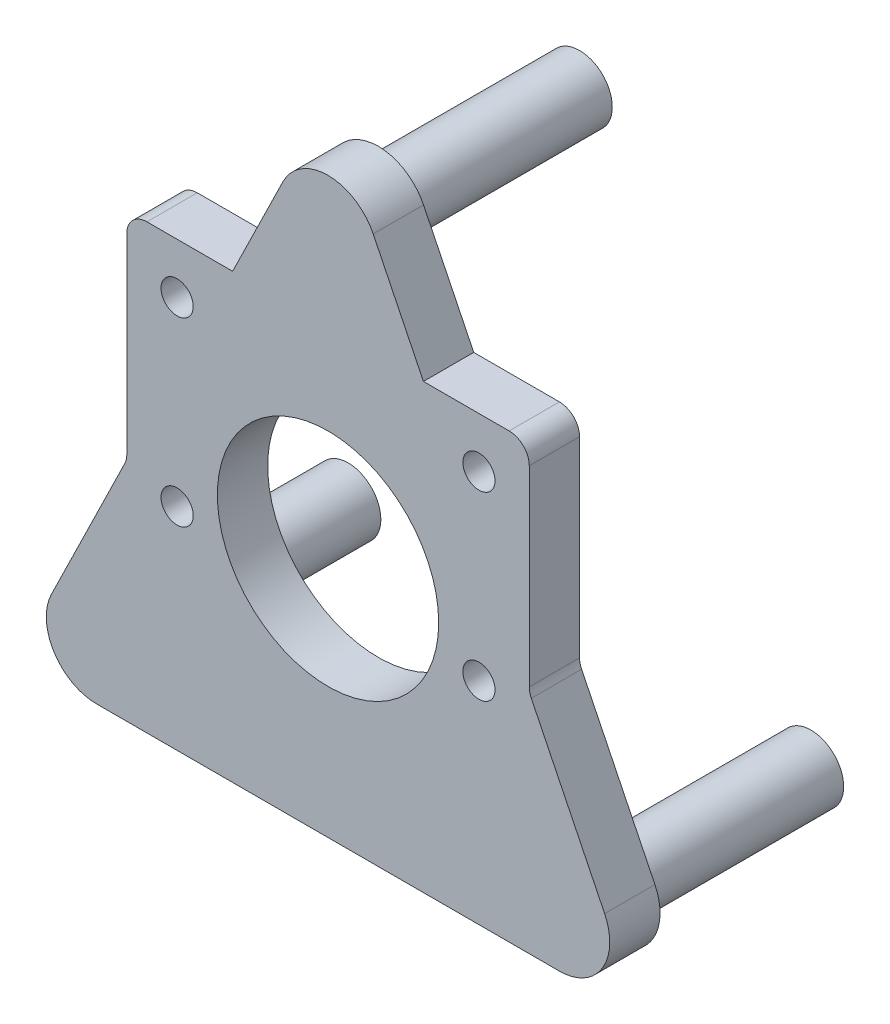
ISO-10303-21;
HEADER;
FILE_DESCRIPTION(('STEP AP214'),'2;1');
FILE_NAME('part.step','',(''),(''),'','','');
FILE_SCHEMA(('AUTOMOTIVE_DESIGN { 1 0 10303 214 1 1 1 1 }'));
ENDSEC;
DATA;
#1=APPLICATION_CONTEXT('core data for automotive mechanical design processes');
#2=APPLICATION_PROTOCOL_DEFINITION('international standard','automotive_design',2000,#1);
#3=PRODUCT_CONTEXT('',#1,'mechanical');
#4=PRODUCT('Part','Part','',(#3));
#5=PRODUCT_RELATED_PRODUCT_CATEGORY('part','',(#4));
#6=PRODUCT_DEFINITION_FORMATION('','',#4);
#7=PRODUCT_DEFINITION_CONTEXT('part definition',#1,'design');
#8=PRODUCT_DEFINITION('design','',#6,#7);
#9=PRODUCT_DEFINITION_SHAPE('','',#8);
#10=(LENGTH_UNIT() NAMED_UNIT(*) SI_UNIT(.MILLI.,.METRE.));
#11=(NAMED_UNIT(*) PLANE_ANGLE_UNIT() SI_UNIT($,.RADIAN.));
#12=(NAMED_UNIT(*) SI_UNIT($,.STERADIAN.) SOLID_ANGLE_UNIT());
#13=UNCERTAINTY_MEASURE_WITH_UNIT(LENGTH_MEASURE(1.E-05),#10,'distance_accuracy_value','');
#14=(GEOMETRIC_REPRESENTATION_CONTEXT(3) GLOBAL_UNCERTAINTY_ASSIGNED_CONTEXT((#13)) GLOBAL_UNIT_ASSIGNED_CONTEXT((#10,
#11,#12)) REPRESENTATION_CONTEXT('',''));
#15=CARTESIAN_POINT('',(0.,0.,0.));
#16=DIRECTION('',(0.,0.,1.));
#17=DIRECTION('',(1.,0.,0.));
#18=AXIS2_PLACEMENT_3D('',#15,#16,#17);
#19=CARTESIAN_POINT('',(4.49108361023889,30.1977643199041,5.));
#20=DIRECTION('',(-0.898216722047777,-0.439552863980827,0.));
#21=DIRECTION('',(0.439552863980827,-0.898216722047777,0.));
#22=AXIS2_PLACEMENT_3D('',#19,#20,#21);
#23=PLANE('',#22);
#24=DIRECTION('',(-0.439552863980827,0.898216722047776,0.));
#25=VECTOR('',#24,1.);
#26=CARTESIAN_POINT('',(4.49108361023889,30.1977643199041,5.));
#27=LINE('',#26,#25);
#28=CARTESIAN_POINT('',(9.48147891572389,20.,5.));
#29=VERTEX_POINT('',#28);
#30=CARTESIAN_POINT('',(4.49108361023889,30.1977643199041,5.));
#31=VERTEX_POINT('',#30);
#32=EDGE_CURVE('E168',#29,#31,#27,.T.);
#33=ORIENTED_EDGE('',*,*,#32,.F.);
#34=DIRECTION('',(0.,0.,1.));
#35=VECTOR('',#34,1.);
#36=CARTESIAN_POINT('',(9.4814789157239,20.,0.));
#37=LINE('',#36,#35);
#38=CARTESIAN_POINT('',(9.4814789157239,20.,0.));
#39=VERTEX_POINT('',#38);
#40=EDGE_CURVE('E156',#39,#29,#37,.T.);
#41=ORIENTED_EDGE('',*,*,#40,.F.);
#42=DIRECTION('',(-0.439552863980827,0.898216722047776,0.));
#43=VECTOR('',#42,1.);
#44=CARTESIAN_POINT('',(4.49108361023889,30.1977643199041,0.));
#45=LINE('',#44,#43);
#46=CARTESIAN_POINT('',(4.49108361023889,30.1977643199041,0.));
#47=VERTEX_POINT('',#46);
#48=EDGE_CURVE('E166',#39,#47,#45,.T.);
#49=ORIENTED_EDGE('',*,*,#48,.T.);
#50=DIRECTION('',(0.,0.,-1.));
#51=VECTOR('',#50,1.);
#52=CARTESIAN_POINT('',(4.49108361023889,30.1977643199041,5.));
#53=LINE('',#52,#51);
#54=EDGE_CURVE('E220',#31,#47,#53,.T.);
#55=ORIENTED_EDGE('',*,*,#54,.F.);
#56=EDGE_LOOP('',(#33,#41,#49,#55));
#57=FACE_BOUND('',#56,.T.);
#58=ADVANCED_FACE('F39',(#57),#23,.F.);
#59=CARTESIAN_POINT('',(-4.49108361023889,30.1977643199041,5.));
#60=DIRECTION('',(0.898216722047777,-0.439552863980827,0.));
#61=DIRECTION('',(0.439552863980827,0.898216722047777,0.));
#62=AXIS2_PLACEMENT_3D('',#59,#60,#61);
#63=PLANE('',#62);
#64=DIRECTION('',(-0.439552863980827,-0.898216722047776,0.));
#65=VECTOR('',#64,1.);
#66=CARTESIAN_POINT('',(-4.49108361023889,30.1977643199041,5.));
#67=LINE('',#66,#65);
#68=CARTESIAN_POINT('',(-20.2035665559044,-1.91035300384722,5.));
#69=VERTEX_POINT('',#68);
#70=CARTESIAN_POINT('',(-27.4910836102389,-16.8022356800959,5.));
#71=VERTEX_POINT('',#70);
#72=EDGE_CURVE('E301',#69,#71,#67,.T.);
#73=ORIENTED_EDGE('',*,*,#72,.F.);
#74=DIRECTION('',(0.,0.,1.));
#75=VECTOR('',#74,1.);
#76=CARTESIAN_POINT('',(-20.2035665559045,-1.91035300384722,5.));
#77=LINE('',#76,#75);
#78=CARTESIAN_POINT('',(-20.2035665559044,-1.91035300384722,0.));
#79=VERTEX_POINT('',#78);
#80=EDGE_CURVE('E269',#69,#79,#77,.F.);
#81=ORIENTED_EDGE('',*,*,#80,.T.);
#82=DIRECTION('',(-0.439552863980827,-0.898216722047776,0.));
#83=VECTOR('',#82,1.);
#84=CARTESIAN_POINT('',(-4.49108361023889,30.1977643199041,0.));
#85=LINE('',#84,#83);
#86=CARTESIAN_POINT('',(-27.4910836102389,-16.8022356800959,0.));
#87=VERTEX_POINT('',#86);
#88=EDGE_CURVE('E191',#79,#87,#85,.T.);
#89=ORIENTED_EDGE('',*,*,#88,.T.);
#90=DIRECTION('',(0.,0.,-1.));
#91=VECTOR('',#90,1.);
#92=CARTESIAN_POINT('',(-27.4910836102389,-16.8022356800959,5.));
#93=LINE('',#92,#91);
#94=EDGE_CURVE('E212',#71,#87,#93,.T.);
#95=ORIENTED_EDGE('',*,*,#94,.F.);
#96=EDGE_LOOP('',(#73,#81,#89,#95));
#97=FACE_BOUND('',#96,.T.);
#98=ADVANCED_FACE('F308',(#97),#63,.F.);
#99=CARTESIAN_POINT('',(23.,-19.,5.));
#100=DIRECTION('',(0.,0.,1.));
#101=DIRECTION('',(1.,0.,0.));
#102=AXIS2_PLACEMENT_3D('',#99,#100,#101);
#103=PLANE('',#102);
#104=CARTESIAN_POINT('',(-14.9999999999998,-3.,5.));
#105=DIRECTION('',(0.,0.,1.));
#106=DIRECTION('',(1.,0.,0.));
#107=AXIS2_PLACEMENT_3D('',#104,#105,#106);
#108=CIRCLE('',#107,1.6);
#109=CARTESIAN_POINT('',(-13.3999999999998,-3.,5.));
#110=VERTEX_POINT('',#109);
#111=EDGE_CURVE('E415',#110,#110,#108,.T.);
#112=ORIENTED_EDGE('',*,*,#111,.F.);
#113=EDGE_LOOP('',(#112));
#114=FACE_BOUND('',#113,.T.);
#115=CARTESIAN_POINT('',(15.0000000000002,-3.,5.));
#116=DIRECTION('',(0.,0.,1.));
#117=DIRECTION('',(1.,0.,0.));
#118=AXIS2_PLACEMENT_3D('',#115,#116,#117);
#119=CIRCLE('',#118,1.6);
#120=CARTESIAN_POINT('',(16.6000000000002,-3.,5.));
#121=VERTEX_POINT('',#120);
#122=EDGE_CURVE('E423',#121,#121,#119,.T.);
#123=ORIENTED_EDGE('',*,*,#122,.F.);
#124=EDGE_LOOP('',(#123));
#125=FACE_BOUND('',#124,.T.);
#126=CARTESIAN_POINT('',(15.,15.,5.));
#127=DIRECTION('',(0.,0.,1.));
#128=DIRECTION('',(1.,0.,0.));
#129=AXIS2_PLACEMENT_3D('',#126,#127,#128);
#130=CIRCLE('',#129,1.6);
#131=CARTESIAN_POINT('',(16.6,15.,5.));
#132=VERTEX_POINT('',#131);
#133=EDGE_CURVE('E431',#132,#132,#130,.T.);
#134=ORIENTED_EDGE('',*,*,#133,.F.);
#135=EDGE_LOOP('',(#134));
#136=FACE_BOUND('',#135,.T.);
#137=CARTESIAN_POINT('',(-15.,15.,5.));
#138=DIRECTION('',(0.,0.,1.));
#139=DIRECTION('',(1.,0.,0.));
#140=AXIS2_PLACEMENT_3D('',#137,#138,#139);
#141=CIRCLE('',#140,1.6);
#142=CARTESIAN_POINT('',(-13.4,15.,5.));
#143=VERTEX_POINT('',#142);
#144=EDGE_CURVE('E407',#143,#143,#141,.T.);
#145=ORIENTED_EDGE('',*,*,#144,.F.);
#146=EDGE_LOOP('',(#145));
#147=FACE_BOUND('',#146,.T.);
#148=DIRECTION('',(0.,1.,0.));
#149=VECTOR('',#148,1.);
#150=CARTESIAN_POINT('',(20.,20.,5.));
#151=LINE('',#150,#149);
#152=CARTESIAN_POINT('',(20.,-1.03124727588557,5.));
#153=VERTEX_POINT('',#152);
#154=CARTESIAN_POINT('',(20.,18.,5.));
#155=VERTEX_POINT('',#154);
#156=EDGE_CURVE('E162',#153,#155,#151,.T.);
#157=ORIENTED_EDGE('',*,*,#156,.T.);
#158=CARTESIAN_POINT('',(18.,18.,5.));
#159=DIRECTION('',(0.,0.,1.));
#160=DIRECTION('',(1.,0.,0.));
#161=AXIS2_PLACEMENT_3D('',#158,#159,#160);
#162=CIRCLE('',#161,2.);
#163=CARTESIAN_POINT('',(18.,20.,5.));
#164=VERTEX_POINT('',#163);
#165=EDGE_CURVE('E275',#155,#164,#162,.T.);
#166=ORIENTED_EDGE('',*,*,#165,.T.);
#167=DIRECTION('',(-1.,0.,0.));
#168=VECTOR('',#167,1.);
#169=CARTESIAN_POINT('',(9.4814789157239,20.,5.));
#170=LINE('',#169,#168);
#171=EDGE_CURVE('E396',#164,#29,#170,.T.);
#172=ORIENTED_EDGE('',*,*,#171,.T.);
#173=ORIENTED_EDGE('',*,*,#32,.T.);
#174=CARTESIAN_POINT('',(0.,28.,5.));
#175=DIRECTION('',(0.,0.,1.));
#176=DIRECTION('',(1.,0.,0.));
#177=AXIS2_PLACEMENT_3D('',#174,#175,#176);
#178=CIRCLE('',#177,5.00000000000001);
#179=CARTESIAN_POINT('',(-4.49108361023889,30.1977643199041,5.));
#180=VERTEX_POINT('',#179);
#181=EDGE_CURVE('E313',#31,#180,#178,.T.);
#182=ORIENTED_EDGE('',*,*,#181,.T.);
#183=CARTESIAN_POINT('',(-9.48147891572389,20.,5.));
#184=VERTEX_POINT('',#183);
#185=EDGE_CURVE('E312',#180,#184,#67,.T.);
#186=ORIENTED_EDGE('',*,*,#185,.T.);
#187=DIRECTION('',(-1.,0.,0.));
#188=VECTOR('',#187,1.);
#189=CARTESIAN_POINT('',(-20.,20.,5.));
#190=LINE('',#189,#188);
#191=CARTESIAN_POINT('',(-18.,20.,5.));
#192=VERTEX_POINT('',#191);
#193=EDGE_CURVE('E325',#184,#192,#190,.T.);
#194=ORIENTED_EDGE('',*,*,#193,.T.);
#195=CARTESIAN_POINT('',(-18.,18.,5.));
#196=DIRECTION('',(0.,0.,1.));
#197=DIRECTION('',(1.,0.,0.));
#198=AXIS2_PLACEMENT_3D('',#195,#196,#197);
#199=CIRCLE('',#198,2.);
#200=CARTESIAN_POINT('',(-20.,18.,5.));
#201=VERTEX_POINT('',#200);
#202=EDGE_CURVE('E272',#192,#201,#199,.T.);
#203=ORIENTED_EDGE('',*,*,#202,.T.);
#204=DIRECTION('',(0.,-1.,0.));
#205=VECTOR('',#204,1.);
#206=CARTESIAN_POINT('',(-20.,20.,5.));
#207=LINE('',#206,#205);
#208=CARTESIAN_POINT('',(-20.,-1.03124727588557,5.));
#209=VERTEX_POINT('',#208);
#210=EDGE_CURVE('E170',#201,#209,#207,.T.);
#211=ORIENTED_EDGE('',*,*,#210,.T.);
#212=CARTESIAN_POINT('',(-22.,-1.03124727588557,5.));
#213=DIRECTION('',(0.,0.,1.));
#214=DIRECTION('',(1.,0.,0.));
#215=AXIS2_PLACEMENT_3D('',#212,#213,#214);
#216=CIRCLE('',#215,2.);
#217=EDGE_CURVE('E48',#209,#69,#216,.F.);
#218=ORIENTED_EDGE('',*,*,#217,.T.);
#219=ORIENTED_EDGE('',*,*,#72,.T.);
#220=CARTESIAN_POINT('',(-23.,-19.,5.));
#221=DIRECTION('',(0.,0.,1.));
#222=DIRECTION('',(1.,0.,0.));
#223=AXIS2_PLACEMENT_3D('',#220,#221,#222);
#224=CIRCLE('',#223,5.);
#225=CARTESIAN_POINT('',(-23.,-24.,5.));
#226=VERTEX_POINT('',#225);
#227=EDGE_CURVE('E370',#71,#226,#224,.T.);
#228=ORIENTED_EDGE('',*,*,#227,.T.);
#229=DIRECTION('',(1.,0.,0.));
#230=VECTOR('',#229,1.);
#231=CARTESIAN_POINT('',(-23.,-24.,5.));
#232=LINE('',#231,#230);
#233=CARTESIAN_POINT('',(23.,-24.,5.));
#234=VERTEX_POINT('',#233);
#235=EDGE_CURVE('E208',#226,#234,#232,.T.);
#236=ORIENTED_EDGE('',*,*,#235,.T.);
#237=CARTESIAN_POINT('',(23.,-19.,5.));
#238=DIRECTION('',(0.,0.,1.));
#239=DIRECTION('',(1.,0.,0.));
#240=AXIS2_PLACEMENT_3D('',#237,#238,#239);
#241=CIRCLE('',#240,5.00000000000001);
#242=CARTESIAN_POINT('',(27.4910836102389,-16.8022356800959,5.));
#243=VERTEX_POINT('',#242);
#244=EDGE_CURVE('E202',#234,#243,#241,.T.);
#245=ORIENTED_EDGE('',*,*,#244,.T.);
#246=CARTESIAN_POINT('',(20.2035665559044,-1.91035300384722,5.));
#247=VERTEX_POINT('',#246);
#248=EDGE_CURVE('E362',#243,#247,#27,.T.);
#249=ORIENTED_EDGE('',*,*,#248,.T.);
#250=CARTESIAN_POINT('',(22.,-1.03124727588557,5.));
#251=DIRECTION('',(0.,0.,1.));
#252=DIRECTION('',(1.,0.,0.));
#253=AXIS2_PLACEMENT_3D('',#250,#251,#252);
#254=CIRCLE('',#253,2.);
#255=EDGE_CURVE('E289',#247,#153,#254,.F.);
#256=ORIENTED_EDGE('',*,*,#255,.T.);
#257=EDGE_LOOP('',(#157,#166,#172,#173,#182,#186,#194,#203,#211,#218,#219,#228,#236,#245,#249,#256));
#258=FACE_BOUND('',#257,.T.);
#259=CARTESIAN_POINT('',(0.,0.,5.));
#260=DIRECTION('',(0.,0.,1.));
#261=DIRECTION('',(1.,0.,0.));
#262=AXIS2_PLACEMENT_3D('',#259,#260,#261);
#263=CIRCLE('',#262,11.);
#264=CARTESIAN_POINT('',(11.,0.,5.));
#265=VERTEX_POINT('',#264);
#266=EDGE_CURVE('E185',#265,#265,#263,.T.);
#267=ORIENTED_EDGE('',*,*,#266,.F.);
#268=EDGE_LOOP('',(#267));
#269=FACE_BOUND('',#268,.T.);
#270=ADVANCED_FACE('F299',(#114,#125,#136,#147,#258,#269),#103,.T.);
#271=CARTESIAN_POINT('',(23.,-19.,0.));
#272=DIRECTION('',(0.,0.,1.));
#273=DIRECTION('',(1.,0.,0.));
#274=AXIS2_PLACEMENT_3D('',#271,#272,#273);
#275=PLANE('',#274);
#276=CARTESIAN_POINT('',(-14.9999999999998,-3.,0.));
#277=DIRECTION('',(0.,0.,1.));
#278=DIRECTION('',(1.,0.,0.));
#279=AXIS2_PLACEMENT_3D('',#276,#277,#278);
#280=CIRCLE('',#279,1.6);
#281=CARTESIAN_POINT('',(-13.3999999999998,-3.,0.));
#282=VERTEX_POINT('',#281);
#283=EDGE_CURVE('E419',#282,#282,#280,.T.);
#284=ORIENTED_EDGE('',*,*,#283,.T.);
#285=EDGE_LOOP('',(#284));
#286=FACE_BOUND('',#285,.T.);
#287=CARTESIAN_POINT('',(15.0000000000002,-3.,0.));
#288=DIRECTION('',(0.,0.,1.));
#289=DIRECTION('',(1.,0.,0.));
#290=AXIS2_PLACEMENT_3D('',#287,#288,#289);
#291=CIRCLE('',#290,1.6);
#292=CARTESIAN_POINT('',(16.6000000000002,-3.,0.));
#293=VERTEX_POINT('',#292);
#294=EDGE_CURVE('E427',#293,#293,#291,.T.);
#295=ORIENTED_EDGE('',*,*,#294,.T.);
#296=EDGE_LOOP('',(#295));
#297=FACE_BOUND('',#296,.T.);
#298=CARTESIAN_POINT('',(15.,15.,0.));
#299=DIRECTION('',(0.,0.,1.));
#300=DIRECTION('',(1.,0.,0.));
#301=AXIS2_PLACEMENT_3D('',#298,#299,#300);
#302=CIRCLE('',#301,1.6);
#303=CARTESIAN_POINT('',(16.6,15.,0.));
#304=VERTEX_POINT('',#303);
#305=EDGE_CURVE('E413',#304,#304,#302,.T.);
#306=ORIENTED_EDGE('',*,*,#305,.T.);
#307=EDGE_LOOP('',(#306));
#308=FACE_BOUND('',#307,.T.);
#309=CARTESIAN_POINT('',(-15.,15.,0.));
#310=DIRECTION('',(0.,0.,1.));
#311=DIRECTION('',(1.,0.,0.));
#312=AXIS2_PLACEMENT_3D('',#309,#310,#311);
#313=CIRCLE('',#312,1.6);
#314=CARTESIAN_POINT('',(-13.4,15.,0.));
#315=VERTEX_POINT('',#314);
#316=EDGE_CURVE('E404',#315,#315,#313,.T.);
#317=ORIENTED_EDGE('',*,*,#316,.T.);
#318=EDGE_LOOP('',(#317));
#319=FACE_BOUND('',#318,.T.);
#320=CARTESIAN_POINT('',(-23.,-19.,0.));
#321=DIRECTION('',(0.,0.,1.));
#322=DIRECTION('',(1.,0.,0.));
#323=AXIS2_PLACEMENT_3D('',#320,#321,#322);
#324=CIRCLE('',#323,4.25);
#325=CARTESIAN_POINT('',(-18.75,-19.,0.));
#326=VERTEX_POINT('',#325);
#327=EDGE_CURVE('E239',#326,#326,#324,.T.);
#328=ORIENTED_EDGE('',*,*,#327,.T.);
#329=EDGE_LOOP('',(#328));
#330=FACE_BOUND('',#329,.T.);
#331=CARTESIAN_POINT('',(23.,-19.,0.));
#332=DIRECTION('',(0.,0.,1.));
#333=DIRECTION('',(1.,0.,0.));
#334=AXIS2_PLACEMENT_3D('',#331,#332,#333);
#335=CIRCLE('',#334,4.25);
#336=CARTESIAN_POINT('',(27.25,-19.,0.));
#337=VERTEX_POINT('',#336);
#338=EDGE_CURVE('E235',#337,#337,#335,.T.);
#339=ORIENTED_EDGE('',*,*,#338,.T.);
#340=EDGE_LOOP('',(#339));
#341=FACE_BOUND('',#340,.T.);
#342=CARTESIAN_POINT('',(0.,28.,0.));
#343=DIRECTION('',(0.,0.,1.));
#344=DIRECTION('',(1.,0.,0.));
#345=AXIS2_PLACEMENT_3D('',#342,#343,#344);
#346=CIRCLE('',#345,4.25);
#347=CARTESIAN_POINT('',(4.25,28.,0.));
#348=VERTEX_POINT('',#347);
#349=EDGE_CURVE('E231',#348,#348,#346,.T.);
#350=ORIENTED_EDGE('',*,*,#349,.T.);
#351=EDGE_LOOP('',(#350));
#352=FACE_BOUND('',#351,.T.);
#353=DIRECTION('',(-1.,0.,0.));
#354=VECTOR('',#353,1.);
#355=CARTESIAN_POINT('',(9.4814789157239,20.,0.));
#356=LINE('',#355,#354);
#357=CARTESIAN_POINT('',(18.,20.,0.));
#358=VERTEX_POINT('',#357);
#359=EDGE_CURVE('E153',#358,#39,#356,.T.);
#360=ORIENTED_EDGE('',*,*,#359,.F.);
#361=CARTESIAN_POINT('',(18.,18.,0.));
#362=DIRECTION('',(0.,0.,1.));
#363=DIRECTION('',(1.,0.,0.));
#364=AXIS2_PLACEMENT_3D('',#361,#362,#363);
#365=CIRCLE('',#364,2.);
#366=CARTESIAN_POINT('',(20.,18.,0.));
#367=VERTEX_POINT('',#366);
#368=EDGE_CURVE('E282',#358,#367,#365,.F.);
#369=ORIENTED_EDGE('',*,*,#368,.T.);
#370=DIRECTION('',(0.,1.,0.));
#371=VECTOR('',#370,1.);
#372=CARTESIAN_POINT('',(20.,20.,0.));
#373=LINE('',#372,#371);
#374=CARTESIAN_POINT('',(20.,-1.03124727588557,0.));
#375=VERTEX_POINT('',#374);
#376=EDGE_CURVE('E161',#375,#367,#373,.T.);
#377=ORIENTED_EDGE('',*,*,#376,.F.);
#378=CARTESIAN_POINT('',(22.,-1.03124727588557,0.));
#379=DIRECTION('',(0.,0.,1.));
#380=DIRECTION('',(1.,0.,0.));
#381=AXIS2_PLACEMENT_3D('',#378,#379,#380);
#382=CIRCLE('',#381,2.);
#383=CARTESIAN_POINT('',(20.2035665559044,-1.91035300384722,0.));
#384=VERTEX_POINT('',#383);
#385=EDGE_CURVE('E292',#375,#384,#382,.T.);
#386=ORIENTED_EDGE('',*,*,#385,.T.);
#387=CARTESIAN_POINT('',(27.4910836102389,-16.8022356800959,0.));
#388=VERTEX_POINT('',#387);
#389=EDGE_CURVE('E178',#388,#384,#45,.T.);
#390=ORIENTED_EDGE('',*,*,#389,.F.);
#391=CARTESIAN_POINT('',(23.,-19.,0.));
#392=DIRECTION('',(0.,0.,1.));
#393=DIRECTION('',(1.,0.,0.));
#394=AXIS2_PLACEMENT_3D('',#391,#392,#393);
#395=CIRCLE('',#394,5.00000000000001);
#396=CARTESIAN_POINT('',(23.,-24.,0.));
#397=VERTEX_POINT('',#396);
#398=EDGE_CURVE('E179',#397,#388,#395,.T.);
#399=ORIENTED_EDGE('',*,*,#398,.F.);
#400=DIRECTION('',(1.,0.,0.));
#401=VECTOR('',#400,1.);
#402=CARTESIAN_POINT('',(-23.,-24.,0.));
#403=LINE('',#402,#401);
#404=CARTESIAN_POINT('',(-23.,-24.,0.));
#405=VERTEX_POINT('',#404);
#406=EDGE_CURVE('E199',#405,#397,#403,.T.);
#407=ORIENTED_EDGE('',*,*,#406,.F.);
#408=CARTESIAN_POINT('',(-23.,-19.,0.));
#409=DIRECTION('',(0.,0.,1.));
#410=DIRECTION('',(1.,0.,0.));
#411=AXIS2_PLACEMENT_3D('',#408,#409,#410);
#412=CIRCLE('',#411,5.);
#413=EDGE_CURVE('E196',#87,#405,#412,.T.);
#414=ORIENTED_EDGE('',*,*,#413,.F.);
#415=ORIENTED_EDGE('',*,*,#88,.F.);
#416=CARTESIAN_POINT('',(-22.,-1.03124727588557,0.));
#417=DIRECTION('',(0.,0.,1.));
#418=DIRECTION('',(1.,0.,0.));
#419=AXIS2_PLACEMENT_3D('',#416,#417,#418);
#420=CIRCLE('',#419,2.);
#421=CARTESIAN_POINT('',(-20.,-1.03124727588557,0.));
#422=VERTEX_POINT('',#421);
#423=EDGE_CURVE('E11',#79,#422,#420,.T.);
#424=ORIENTED_EDGE('',*,*,#423,.T.);
#425=DIRECTION('',(0.,-1.,0.));
#426=VECTOR('',#425,1.);
#427=CARTESIAN_POINT('',(-20.,20.,0.));
#428=LINE('',#427,#426);
#429=CARTESIAN_POINT('',(-20.,18.,0.));
#430=VERTEX_POINT('',#429);
#431=EDGE_CURVE('E318',#430,#422,#428,.T.);
#432=ORIENTED_EDGE('',*,*,#431,.F.);
#433=CARTESIAN_POINT('',(-18.,18.,0.));
#434=DIRECTION('',(0.,0.,1.));
#435=DIRECTION('',(1.,0.,0.));
#436=AXIS2_PLACEMENT_3D('',#433,#434,#435);
#437=CIRCLE('',#436,2.);
#438=CARTESIAN_POINT('',(-18.,20.,0.));
#439=VERTEX_POINT('',#438);
#440=EDGE_CURVE('E55',#430,#439,#437,.F.);
#441=ORIENTED_EDGE('',*,*,#440,.T.);
#442=DIRECTION('',(-1.,0.,0.));
#443=VECTOR('',#442,1.);
#444=CARTESIAN_POINT('',(-20.,20.,0.));
#445=LINE('',#444,#443);
#446=CARTESIAN_POINT('',(-9.48147891572389,20.,0.));
#447=VERTEX_POINT('',#446);
#448=EDGE_CURVE('E324',#447,#439,#445,.T.);
#449=ORIENTED_EDGE('',*,*,#448,.F.);
#450=CARTESIAN_POINT('',(-4.49108361023889,30.1977643199041,0.));
#451=VERTEX_POINT('',#450);
#452=EDGE_CURVE('E192',#451,#447,#85,.T.);
#453=ORIENTED_EDGE('',*,*,#452,.F.);
#454=CARTESIAN_POINT('',(0.,28.,0.));
#455=DIRECTION('',(0.,0.,1.));
#456=DIRECTION('',(1.,0.,0.));
#457=AXIS2_PLACEMENT_3D('',#454,#455,#456);
#458=CIRCLE('',#457,5.00000000000001);
#459=EDGE_CURVE('E176',#47,#451,#458,.T.);
#460=ORIENTED_EDGE('',*,*,#459,.F.);
#461=ORIENTED_EDGE('',*,*,#48,.F.);
#462=EDGE_LOOP('',(#360,#369,#377,#386,#390,#399,#407,#414,#415,#424,#432,#441,#449,#453,#460,#461));
#463=FACE_BOUND('',#462,.T.);
#464=CARTESIAN_POINT('',(0.,0.,0.));
#465=DIRECTION('',(0.,0.,1.));
#466=DIRECTION('',(1.,0.,0.));
#467=AXIS2_PLACEMENT_3D('',#464,#465,#466);
#468=CIRCLE('',#467,11.);
#469=CARTESIAN_POINT('',(11.,0.,0.));
#470=VERTEX_POINT('',#469);
#471=EDGE_CURVE('E352',#470,#470,#468,.T.);
#472=ORIENTED_EDGE('',*,*,#471,.T.);
#473=EDGE_LOOP('',(#472));
#474=FACE_BOUND('',#473,.T.);
#475=ADVANCED_FACE('F173',(#286,#297,#308,#319,#330,#341,#352,#463,#474),#275,.F.);
#476=CARTESIAN_POINT('',(23.,-19.,5.));
#477=DIRECTION('',(0.,0.,-1.));
#478=DIRECTION('',(-1.,0.,0.));
#479=AXIS2_PLACEMENT_3D('',#476,#477,#478);
#480=CYLINDRICAL_SURFACE('',#479,5.00000000000001);
#481=ORIENTED_EDGE('',*,*,#398,.T.);
#482=DIRECTION('',(0.,0.,-1.));
#483=VECTOR('',#482,1.);
#484=CARTESIAN_POINT('',(27.4910836102389,-16.8022356800959,5.));
#485=LINE('',#484,#483);
#486=EDGE_CURVE('E223',#243,#388,#485,.T.);
#487=ORIENTED_EDGE('',*,*,#486,.F.);
#488=ORIENTED_EDGE('',*,*,#244,.F.);
#489=DIRECTION('',(0.,0.,-1.));
#490=VECTOR('',#489,1.);
#491=CARTESIAN_POINT('',(23.,-24.,5.));
#492=LINE('',#491,#490);
#493=EDGE_CURVE('E203',#234,#397,#492,.T.);
#494=ORIENTED_EDGE('',*,*,#493,.T.);
#495=EDGE_LOOP('',(#481,#487,#488,#494));
#496=FACE_BOUND('',#495,.T.);
#497=ADVANCED_FACE('F383',(#496),#480,.T.);
#498=ORIENTED_EDGE('',*,*,#389,.T.);
#499=DIRECTION('',(0.,0.,1.));
#500=VECTOR('',#499,1.);
#501=CARTESIAN_POINT('',(20.2035665559044,-1.91035300384722,5.));
#502=LINE('',#501,#500);
#503=EDGE_CURVE('E251',#384,#247,#502,.T.);
#504=ORIENTED_EDGE('',*,*,#503,.T.);
#505=ORIENTED_EDGE('',*,*,#248,.F.);
#506=ORIENTED_EDGE('',*,*,#486,.T.);
#507=EDGE_LOOP('',(#498,#504,#505,#506));
#508=FACE_BOUND('',#507,.T.);
#509=ADVANCED_FACE('F385',(#508),#23,.F.);
#510=CARTESIAN_POINT('',(0.,28.,5.));
#511=DIRECTION('',(0.,0.,-1.));
#512=DIRECTION('',(-1.,0.,0.));
#513=AXIS2_PLACEMENT_3D('',#510,#511,#512);
#514=CYLINDRICAL_SURFACE('',#513,5.00000000000001);
#515=ORIENTED_EDGE('',*,*,#459,.T.);
#516=DIRECTION('',(0.,0.,-1.));
#517=VECTOR('',#516,1.);
#518=CARTESIAN_POINT('',(-4.49108361023889,30.1977643199041,5.));
#519=LINE('',#518,#517);
#520=EDGE_CURVE('E216',#180,#451,#519,.T.);
#521=ORIENTED_EDGE('',*,*,#520,.F.);
#522=ORIENTED_EDGE('',*,*,#181,.F.);
#523=ORIENTED_EDGE('',*,*,#54,.T.);
#524=EDGE_LOOP('',(#515,#521,#522,#523));
#525=FACE_BOUND('',#524,.T.);
#526=ADVANCED_FACE('F474',(#525),#514,.T.);
#527=ORIENTED_EDGE('',*,*,#452,.T.);
#528=DIRECTION('',(0.,0.,1.));
#529=VECTOR('',#528,1.);
#530=CARTESIAN_POINT('',(-9.48147891572389,20.,0.));
#531=LINE('',#530,#529);
#532=EDGE_CURVE('E329',#447,#184,#531,.T.);
#533=ORIENTED_EDGE('',*,*,#532,.T.);
#534=ORIENTED_EDGE('',*,*,#185,.F.);
#535=ORIENTED_EDGE('',*,*,#520,.T.);
#536=EDGE_LOOP('',(#527,#533,#534,#535));
#537=FACE_BOUND('',#536,.T.);
#538=ADVANCED_FACE('F470',(#537),#63,.F.);
#539=CARTESIAN_POINT('',(-23.,-19.,5.));
#540=DIRECTION('',(0.,0.,-1.));
#541=DIRECTION('',(-1.,0.,0.));
#542=AXIS2_PLACEMENT_3D('',#539,#540,#541);
#543=CYLINDRICAL_SURFACE('',#542,5.);
#544=ORIENTED_EDGE('',*,*,#413,.T.);
#545=DIRECTION('',(0.,0.,-1.));
#546=VECTOR('',#545,1.);
#547=CARTESIAN_POINT('',(-23.,-24.,5.));
#548=LINE('',#547,#546);
#549=EDGE_CURVE('E207',#226,#405,#548,.T.);
#550=ORIENTED_EDGE('',*,*,#549,.F.);
#551=ORIENTED_EDGE('',*,*,#227,.F.);
#552=ORIENTED_EDGE('',*,*,#94,.T.);
#553=EDGE_LOOP('',(#544,#550,#551,#552));
#554=FACE_BOUND('',#553,.T.);
#555=ADVANCED_FACE('F685',(#554),#543,.T.);
#556=CARTESIAN_POINT('',(-23.,-24.,5.));
#557=DIRECTION('',(0.,1.,0.));
#558=DIRECTION('',(-1.,0.,0.));
#559=AXIS2_PLACEMENT_3D('',#556,#557,#558);
#560=PLANE('',#559);
#561=ORIENTED_EDGE('',*,*,#406,.T.);
#562=ORIENTED_EDGE('',*,*,#493,.F.);
#563=ORIENTED_EDGE('',*,*,#235,.F.);
#564=ORIENTED_EDGE('',*,*,#549,.T.);
#565=EDGE_LOOP('',(#561,#562,#563,#564));
#566=FACE_BOUND('',#565,.T.);
#567=ADVANCED_FACE('F379',(#566),#560,.F.);
#568=CARTESIAN_POINT('',(0.,0.,5.));
#569=DIRECTION('',(0.,0.,-1.));
#570=DIRECTION('',(-1.,0.,0.));
#571=AXIS2_PLACEMENT_3D('',#568,#569,#570);
#572=CYLINDRICAL_SURFACE('',#571,11.);
#573=ORIENTED_EDGE('',*,*,#266,.T.);
#574=EDGE_LOOP('',(#573));
#575=FACE_BOUND('',#574,.T.);
#576=ORIENTED_EDGE('',*,*,#471,.F.);
#577=EDGE_LOOP('',(#576));
#578=FACE_BOUND('',#577,.T.);
#579=ADVANCED_FACE('F671',(#575,#578),#572,.F.);
#580=CARTESIAN_POINT('',(0.,28.,-20.));
#581=DIRECTION('',(0.,0.,1.));
#582=DIRECTION('',(1.,0.,0.));
#583=AXIS2_PLACEMENT_3D('',#580,#581,#582);
#584=CYLINDRICAL_SURFACE('',#583,3.25);
#585=CARTESIAN_POINT('',(0.,28.,-1.));
#586=DIRECTION('',(0.,0.,1.));
#587=DIRECTION('',(1.,0.,0.));
#588=AXIS2_PLACEMENT_3D('',#585,#586,#587);
#589=CIRCLE('',#588,3.25);
#590=CARTESIAN_POINT('',(3.25,28.,-1.));
#591=VERTEX_POINT('',#590);
#592=EDGE_CURVE('E247',#591,#591,#589,.F.);
#593=ORIENTED_EDGE('',*,*,#592,.T.);
#594=EDGE_LOOP('',(#593));
#595=FACE_BOUND('',#594,.T.);
#596=CARTESIAN_POINT('',(0.,28.,-20.));
#597=DIRECTION('',(0.,0.,-1.));
#598=DIRECTION('',(-1.,0.,0.));
#599=AXIS2_PLACEMENT_3D('',#596,#597,#598);
#600=CIRCLE('',#599,3.25);
#601=CARTESIAN_POINT('',(-3.25,28.,-20.));
#602=VERTEX_POINT('',#601);
#603=EDGE_CURVE('E348',#602,#602,#600,.T.);
#604=ORIENTED_EDGE('',*,*,#603,.F.);
#605=EDGE_LOOP('',(#604));
#606=FACE_BOUND('',#605,.T.);
#607=ADVANCED_FACE('F663',(#595,#606),#584,.T.);
#608=CARTESIAN_POINT('',(0.,28.,-20.));
#609=DIRECTION('',(0.,0.,-1.));
#610=DIRECTION('',(-1.,0.,0.));
#611=AXIS2_PLACEMENT_3D('',#608,#609,#610);
#612=PLANE('',#611);
#613=ORIENTED_EDGE('',*,*,#603,.T.);
#614=EDGE_LOOP('',(#613));
#615=FACE_BOUND('',#614,.T.);
#616=ADVANCED_FACE('F656',(#615),#612,.T.);
#617=CARTESIAN_POINT('',(23.,-19.,-20.));
#618=DIRECTION('',(0.,0.,1.));
#619=DIRECTION('',(1.,0.,0.));
#620=AXIS2_PLACEMENT_3D('',#617,#618,#619);
#621=CYLINDRICAL_SURFACE('',#620,3.25);
#622=CARTESIAN_POINT('',(23.,-19.,-1.));
#623=DIRECTION('',(0.,0.,1.));
#624=DIRECTION('',(1.,0.,0.));
#625=AXIS2_PLACEMENT_3D('',#622,#623,#624);
#626=CIRCLE('',#625,3.25);
#627=CARTESIAN_POINT('',(26.25,-19.,-1.));
#628=VERTEX_POINT('',#627);
#629=EDGE_CURVE('E243',#628,#628,#626,.F.);
#630=ORIENTED_EDGE('',*,*,#629,.T.);
#631=EDGE_LOOP('',(#630));
#632=FACE_BOUND('',#631,.T.);
#633=CARTESIAN_POINT('',(23.,-19.,-20.));
#634=DIRECTION('',(0.,0.,-1.));
#635=DIRECTION('',(-1.,0.,0.));
#636=AXIS2_PLACEMENT_3D('',#633,#634,#635);
#637=CIRCLE('',#636,3.25);
#638=CARTESIAN_POINT('',(19.75,-19.,-20.));
#639=VERTEX_POINT('',#638);
#640=EDGE_CURVE('E344',#639,#639,#637,.T.);
#641=ORIENTED_EDGE('',*,*,#640,.F.);
#642=EDGE_LOOP('',(#641));
#643=FACE_BOUND('',#642,.T.);
#644=ADVANCED_FACE('F648',(#632,#643),#621,.T.);
#645=CARTESIAN_POINT('',(23.,-19.,-20.));
#646=DIRECTION('',(0.,0.,-1.));
#647=DIRECTION('',(-1.,0.,0.));
#648=AXIS2_PLACEMENT_3D('',#645,#646,#647);
#649=PLANE('',#648);
#650=ORIENTED_EDGE('',*,*,#640,.T.);
#651=EDGE_LOOP('',(#650));
#652=FACE_BOUND('',#651,.T.);
#653=ADVANCED_FACE('F640',(#652),#649,.T.);
#654=CARTESIAN_POINT('',(-23.,-19.,-20.));
#655=DIRECTION('',(0.,0.,1.));
#656=DIRECTION('',(1.,0.,0.));
#657=AXIS2_PLACEMENT_3D('',#654,#655,#656);
#658=CYLINDRICAL_SURFACE('',#657,3.25);
#659=CARTESIAN_POINT('',(-23.,-19.,-1.));
#660=DIRECTION('',(0.,0.,1.));
#661=DIRECTION('',(1.,0.,0.));
#662=AXIS2_PLACEMENT_3D('',#659,#660,#661);
#663=CIRCLE('',#662,3.25);
#664=CARTESIAN_POINT('',(-19.75,-19.,-1.));
#665=VERTEX_POINT('',#664);
#666=EDGE_CURVE('E227',#665,#665,#663,.F.);
#667=ORIENTED_EDGE('',*,*,#666,.T.);
#668=EDGE_LOOP('',(#667));
#669=FACE_BOUND('',#668,.T.);
#670=CARTESIAN_POINT('',(-23.,-19.,-20.));
#671=DIRECTION('',(0.,0.,-1.));
#672=DIRECTION('',(-1.,0.,0.));
#673=AXIS2_PLACEMENT_3D('',#670,#671,#672);
#674=CIRCLE('',#673,3.25);
#675=CARTESIAN_POINT('',(-26.25,-19.,-20.));
#676=VERTEX_POINT('',#675);
#677=EDGE_CURVE('E340',#676,#676,#674,.T.);
#678=ORIENTED_EDGE('',*,*,#677,.F.);
#679=EDGE_LOOP('',(#678));
#680=FACE_BOUND('',#679,.T.);
#681=ADVANCED_FACE('F631',(#669,#680),#658,.T.);
#682=CARTESIAN_POINT('',(-23.,-19.,-20.));
#683=DIRECTION('',(0.,0.,-1.));
#684=DIRECTION('',(-1.,0.,0.));
#685=AXIS2_PLACEMENT_3D('',#682,#683,#684);
#686=PLANE('',#685);
#687=ORIENTED_EDGE('',*,*,#677,.T.);
#688=EDGE_LOOP('',(#687));
#689=FACE_BOUND('',#688,.T.);
#690=ADVANCED_FACE('F490',(#689),#686,.T.);
#691=CARTESIAN_POINT('',(-23.,-19.,-1.));
#692=DIRECTION('',(0.,0.,1.));
#693=DIRECTION('',(1.,0.,0.));
#694=AXIS2_PLACEMENT_3D('',#691,#692,#693);
#695=TOROIDAL_SURFACE('',#694,4.25,1.);
#696=ORIENTED_EDGE('',*,*,#327,.F.);
#697=EDGE_LOOP('',(#696));
#698=FACE_BOUND('',#697,.T.);
#699=ORIENTED_EDGE('',*,*,#666,.F.);
#700=EDGE_LOOP('',(#699));
#701=FACE_BOUND('',#700,.T.);
#702=ADVANCED_FACE('F486',(#698,#701),#695,.F.);
#703=CARTESIAN_POINT('',(23.,-19.,-1.));
#704=DIRECTION('',(0.,0.,1.));
#705=DIRECTION('',(1.,0.,0.));
#706=AXIS2_PLACEMENT_3D('',#703,#704,#705);
#707=TOROIDAL_SURFACE('',#706,4.25,1.);
#708=ORIENTED_EDGE('',*,*,#338,.F.);
#709=EDGE_LOOP('',(#708));
#710=FACE_BOUND('',#709,.T.);
#711=ORIENTED_EDGE('',*,*,#629,.F.);
#712=EDGE_LOOP('',(#711));
#713=FACE_BOUND('',#712,.T.);
#714=ADVANCED_FACE('F489',(#710,#713),#707,.F.);
#715=CARTESIAN_POINT('',(0.,28.,-1.));
#716=DIRECTION('',(0.,0.,1.));
#717=DIRECTION('',(1.,0.,0.));
#718=AXIS2_PLACEMENT_3D('',#715,#716,#717);
#719=TOROIDAL_SURFACE('',#718,4.25,1.);
#720=ORIENTED_EDGE('',*,*,#349,.F.);
#721=EDGE_LOOP('',(#720));
#722=FACE_BOUND('',#721,.T.);
#723=ORIENTED_EDGE('',*,*,#592,.F.);
#724=EDGE_LOOP('',(#723));
#725=FACE_BOUND('',#724,.T.);
#726=ADVANCED_FACE('F494',(#722,#725),#719,.F.);
#727=CARTESIAN_POINT('',(-20.,20.,0.));
#728=DIRECTION('',(-1.,0.,0.));
#729=DIRECTION('',(0.,0.,1.));
#730=AXIS2_PLACEMENT_3D('',#727,#728,#729);
#731=PLANE('',#730);
#732=ORIENTED_EDGE('',*,*,#431,.T.);
#733=DIRECTION('',(0.,0.,1.));
#734=VECTOR('',#733,1.);
#735=CARTESIAN_POINT('',(-20.,-1.03124727588557,0.));
#736=LINE('',#735,#734);
#737=EDGE_CURVE('E265',#422,#209,#736,.T.);
#738=ORIENTED_EDGE('',*,*,#737,.T.);
#739=ORIENTED_EDGE('',*,*,#210,.F.);
#740=DIRECTION('',(0.,0.,1.));
#741=VECTOR('',#740,1.);
#742=CARTESIAN_POINT('',(-20.,18.,0.));
#743=LINE('',#742,#741);
#744=EDGE_CURVE('E262',#201,#430,#743,.F.);
#745=ORIENTED_EDGE('',*,*,#744,.T.);
#746=EDGE_LOOP('',(#732,#738,#739,#745));
#747=FACE_BOUND('',#746,.T.);
#748=ADVANCED_FACE('F321',(#747),#731,.T.);
#749=CARTESIAN_POINT('',(-20.,20.,0.));
#750=DIRECTION('',(0.,1.,0.));
#751=DIRECTION('',(0.,0.,1.));
#752=AXIS2_PLACEMENT_3D('',#749,#750,#751);
#753=PLANE('',#752);
#754=ORIENTED_EDGE('',*,*,#448,.T.);
#755=DIRECTION('',(0.,0.,1.));
#756=VECTOR('',#755,1.);
#757=CARTESIAN_POINT('',(-18.,20.,0.));
#758=LINE('',#757,#756);
#759=EDGE_CURVE('E285',#439,#192,#758,.T.);
#760=ORIENTED_EDGE('',*,*,#759,.T.);
#761=ORIENTED_EDGE('',*,*,#193,.F.);
#762=ORIENTED_EDGE('',*,*,#532,.F.);
#763=EDGE_LOOP('',(#754,#760,#761,#762));
#764=FACE_BOUND('',#763,.T.);
#765=ADVANCED_FACE('F575',(#764),#753,.T.);
#766=CARTESIAN_POINT('',(9.4814789157239,20.,0.));
#767=DIRECTION('',(0.,1.,0.));
#768=DIRECTION('',(0.,0.,1.));
#769=AXIS2_PLACEMENT_3D('',#766,#767,#768);
#770=PLANE('',#769);
#771=ORIENTED_EDGE('',*,*,#171,.F.);
#772=DIRECTION('',(0.,0.,1.));
#773=VECTOR('',#772,1.);
#774=CARTESIAN_POINT('',(18.,20.,0.));
#775=LINE('',#774,#773);
#776=EDGE_CURVE('E63',#164,#358,#775,.F.);
#777=ORIENTED_EDGE('',*,*,#776,.T.);
#778=ORIENTED_EDGE('',*,*,#359,.T.);
#779=ORIENTED_EDGE('',*,*,#40,.T.);
#780=EDGE_LOOP('',(#771,#777,#778,#779));
#781=FACE_BOUND('',#780,.T.);
#782=ADVANCED_FACE('F155',(#781),#770,.T.);
#783=CARTESIAN_POINT('',(20.,20.,0.));
#784=DIRECTION('',(1.,0.,0.));
#785=DIRECTION('',(0.,0.,-1.));
#786=AXIS2_PLACEMENT_3D('',#783,#784,#785);
#787=PLANE('',#786);
#788=ORIENTED_EDGE('',*,*,#156,.F.);
#789=DIRECTION('',(0.,0.,1.));
#790=VECTOR('',#789,1.);
#791=CARTESIAN_POINT('',(20.,-1.03124727588557,0.));
#792=LINE('',#791,#790);
#793=EDGE_CURVE('E259',#153,#375,#792,.F.);
#794=ORIENTED_EDGE('',*,*,#793,.T.);
#795=ORIENTED_EDGE('',*,*,#376,.T.);
#796=DIRECTION('',(0.,0.,1.));
#797=VECTOR('',#796,1.);
#798=CARTESIAN_POINT('',(20.,18.,0.));
#799=LINE('',#798,#797);
#800=EDGE_CURVE('E255',#367,#155,#799,.T.);
#801=ORIENTED_EDGE('',*,*,#800,.T.);
#802=EDGE_LOOP('',(#788,#794,#795,#801));
#803=FACE_BOUND('',#802,.T.);
#804=ADVANCED_FACE('F391',(#803),#787,.T.);
#805=CARTESIAN_POINT('',(22.,-1.03124727588557,5.));
#806=DIRECTION('',(0.,0.,1.));
#807=DIRECTION('',(1.,0.,0.));
#808=AXIS2_PLACEMENT_3D('',#805,#806,#807);
#809=CYLINDRICAL_SURFACE('',#808,2.);
#810=ORIENTED_EDGE('',*,*,#385,.F.);
#811=ORIENTED_EDGE('',*,*,#793,.F.);
#812=ORIENTED_EDGE('',*,*,#255,.F.);
#813=ORIENTED_EDGE('',*,*,#503,.F.);
#814=EDGE_LOOP('',(#810,#811,#812,#813));
#815=FACE_BOUND('',#814,.T.);
#816=ADVANCED_FACE('F398',(#815),#809,.F.);
#817=CARTESIAN_POINT('',(-22.,-1.03124727588557,0.));
#818=DIRECTION('',(0.,0.,1.));
#819=DIRECTION('',(1.,0.,0.));
#820=AXIS2_PLACEMENT_3D('',#817,#818,#819);
#821=CYLINDRICAL_SURFACE('',#820,2.);
#822=ORIENTED_EDGE('',*,*,#423,.F.);
#823=ORIENTED_EDGE('',*,*,#80,.F.);
#824=ORIENTED_EDGE('',*,*,#217,.F.);
#825=ORIENTED_EDGE('',*,*,#737,.F.);
#826=EDGE_LOOP('',(#822,#823,#824,#825));
#827=FACE_BOUND('',#826,.T.);
#828=ADVANCED_FACE('F316',(#827),#821,.F.);
#829=CARTESIAN_POINT('',(18.,18.,0.));
#830=DIRECTION('',(0.,0.,1.));
#831=DIRECTION('',(1.,0.,0.));
#832=AXIS2_PLACEMENT_3D('',#829,#830,#831);
#833=CYLINDRICAL_SURFACE('',#832,2.);
#834=ORIENTED_EDGE('',*,*,#368,.F.);
#835=ORIENTED_EDGE('',*,*,#776,.F.);
#836=ORIENTED_EDGE('',*,*,#165,.F.);
#837=ORIENTED_EDGE('',*,*,#800,.F.);
#838=EDGE_LOOP('',(#834,#835,#836,#837));
#839=FACE_BOUND('',#838,.T.);
#840=ADVANCED_FACE('F460',(#839),#833,.T.);
#841=CARTESIAN_POINT('',(-18.,18.,0.));
#842=DIRECTION('',(0.,0.,1.));
#843=DIRECTION('',(1.,0.,0.));
#844=AXIS2_PLACEMENT_3D('',#841,#842,#843);
#845=CYLINDRICAL_SURFACE('',#844,2.);
#846=ORIENTED_EDGE('',*,*,#440,.F.);
#847=ORIENTED_EDGE('',*,*,#744,.F.);
#848=ORIENTED_EDGE('',*,*,#202,.F.);
#849=ORIENTED_EDGE('',*,*,#759,.F.);
#850=EDGE_LOOP('',(#846,#847,#848,#849));
#851=FACE_BOUND('',#850,.T.);
#852=ADVANCED_FACE('F41',(#851),#845,.T.);
#853=CARTESIAN_POINT('',(-15.,15.,0.));
#854=DIRECTION('',(0.,0.,1.));
#855=DIRECTION('',(1.,0.,0.));
#856=AXIS2_PLACEMENT_3D('',#853,#854,#855);
#857=CYLINDRICAL_SURFACE('',#856,1.6);
#858=ORIENTED_EDGE('',*,*,#316,.F.);
#859=EDGE_LOOP('',(#858));
#860=FACE_BOUND('',#859,.T.);
#861=ORIENTED_EDGE('',*,*,#144,.T.);
#862=EDGE_LOOP('',(#861));
#863=FACE_BOUND('',#862,.T.);
#864=ADVANCED_FACE('F444',(#860,#863),#857,.F.);
#865=CARTESIAN_POINT('',(15.,15.,0.));
#866=DIRECTION('',(0.,0.,1.));
#867=DIRECTION('',(1.,0.,0.));
#868=AXIS2_PLACEMENT_3D('',#865,#866,#867);
#869=CYLINDRICAL_SURFACE('',#868,1.6);
#870=ORIENTED_EDGE('',*,*,#305,.F.);
#871=EDGE_LOOP('',(#870));
#872=FACE_BOUND('',#871,.T.);
#873=ORIENTED_EDGE('',*,*,#133,.T.);
#874=EDGE_LOOP('',(#873));
#875=FACE_BOUND('',#874,.T.);
#876=ADVANCED_FACE('F440',(#872,#875),#869,.F.);
#877=CARTESIAN_POINT('',(15.0000000000002,-3.,0.));
#878=DIRECTION('',(0.,0.,1.));
#879=DIRECTION('',(1.,0.,0.));
#880=AXIS2_PLACEMENT_3D('',#877,#878,#879);
#881=CYLINDRICAL_SURFACE('',#880,1.6);
#882=ORIENTED_EDGE('',*,*,#294,.F.);
#883=EDGE_LOOP('',(#882));
#884=FACE_BOUND('',#883,.T.);
#885=ORIENTED_EDGE('',*,*,#122,.T.);
#886=EDGE_LOOP('',(#885));
#887=FACE_BOUND('',#886,.T.);
#888=ADVANCED_FACE('F443',(#884,#887),#881,.F.);
#889=CARTESIAN_POINT('',(-14.9999999999998,-3.,0.));
#890=DIRECTION('',(0.,0.,1.));
#891=DIRECTION('',(1.,0.,0.));
#892=AXIS2_PLACEMENT_3D('',#889,#890,#891);
#893=CYLINDRICAL_SURFACE('',#892,1.6);
#894=ORIENTED_EDGE('',*,*,#283,.F.);
#895=EDGE_LOOP('',(#894));
#896=FACE_BOUND('',#895,.T.);
#897=ORIENTED_EDGE('',*,*,#111,.T.);
#898=EDGE_LOOP('',(#897));
#899=FACE_BOUND('',#898,.T.);
#900=ADVANCED_FACE('F546',(#896,#899),#893,.F.);
#901=CLOSED_SHELL('',(#58,#98,#270,#475,#497,#509,#526,#538,#555,#567,#579,#607,#616,#644,#653,
#681,#690,#702,#714,#726,#748,#765,#782,#804,#816,#828,#840,#852,#864,#876,#888,#900));
#902=MANIFOLD_SOLID_BREP('B2',#901);
#903=ADVANCED_BREP_SHAPE_REPRESENTATION('',(#18,#902),#14);
#904=SHAPE_DEFINITION_REPRESENTATION(#9,#903);
ENDSEC;
END-ISO-10303-21;
